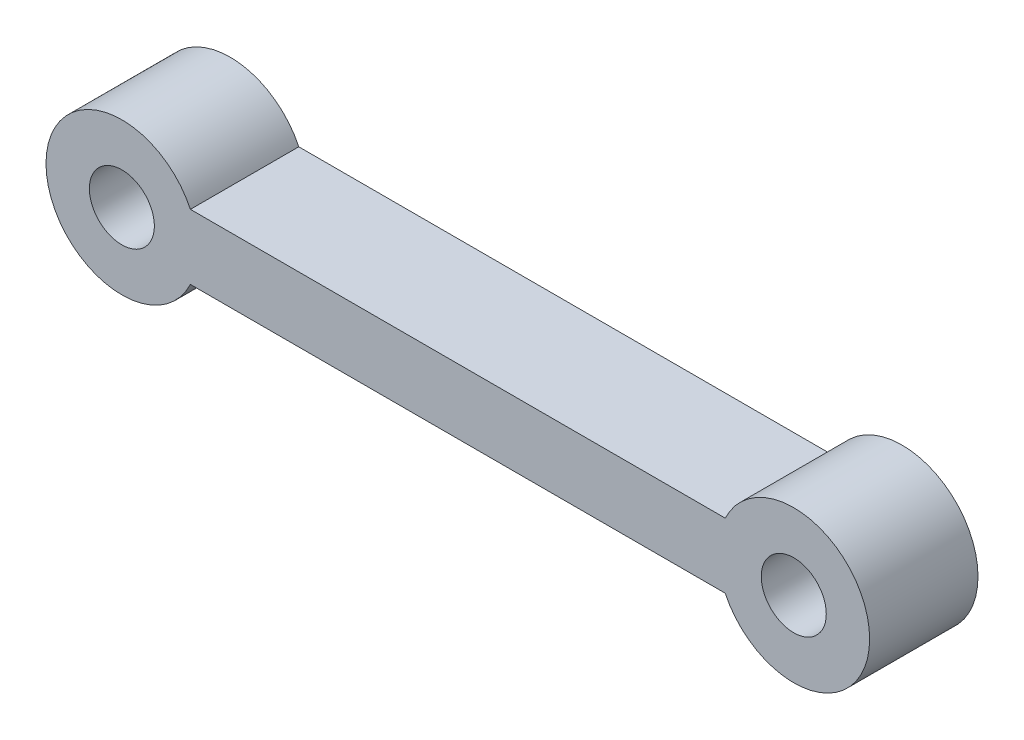
ISO-10303-21;
HEADER;
FILE_DESCRIPTION(('STEP AP214'),'2;1');
FILE_NAME('part.step','',(''),(''),'','','');
FILE_SCHEMA(('AUTOMOTIVE_DESIGN { 1 0 10303 214 1 1 1 1 }'));
ENDSEC;
DATA;
#1=APPLICATION_CONTEXT('core data for automotive mechanical design processes');
#2=APPLICATION_PROTOCOL_DEFINITION('international standard','automotive_design',2000,#1);
#3=PRODUCT_CONTEXT('',#1,'mechanical');
#4=PRODUCT('Part','Part','',(#3));
#5=PRODUCT_RELATED_PRODUCT_CATEGORY('part','',(#4));
#6=PRODUCT_DEFINITION_FORMATION('','',#4);
#7=PRODUCT_DEFINITION_CONTEXT('part definition',#1,'design');
#8=PRODUCT_DEFINITION('design','',#6,#7);
#9=PRODUCT_DEFINITION_SHAPE('','',#8);
#10=(LENGTH_UNIT() NAMED_UNIT(*) SI_UNIT(.MILLI.,.METRE.));
#11=(NAMED_UNIT(*) PLANE_ANGLE_UNIT() SI_UNIT($,.RADIAN.));
#12=(NAMED_UNIT(*) SI_UNIT($,.STERADIAN.) SOLID_ANGLE_UNIT());
#13=UNCERTAINTY_MEASURE_WITH_UNIT(LENGTH_MEASURE(1.E-05),#10,'distance_accuracy_value','');
#14=(GEOMETRIC_REPRESENTATION_CONTEXT(3) GLOBAL_UNCERTAINTY_ASSIGNED_CONTEXT((#13)) GLOBAL_UNIT_ASSIGNED_CONTEXT((#10,
#11,#12)) REPRESENTATION_CONTEXT('',''));
#15=CARTESIAN_POINT('',(0.,0.,0.));
#16=DIRECTION('',(0.,0.,1.));
#17=DIRECTION('',(1.,0.,0.));
#18=AXIS2_PLACEMENT_3D('',#15,#16,#17);
#19=CARTESIAN_POINT('',(31.,0.,5.));
#20=DIRECTION('',(0.,0.,-1.));
#21=DIRECTION('',(-1.,0.,0.));
#22=AXIS2_PLACEMENT_3D('',#19,#20,#21);
#23=CYLINDRICAL_SURFACE('',#22,3.5);
#24=CARTESIAN_POINT('',(31.,0.,0.));
#25=DIRECTION('',(0.,0.,1.));
#26=DIRECTION('',(1.,0.,0.));
#27=AXIS2_PLACEMENT_3D('',#24,#25,#26);
#28=CIRCLE('',#27,3.5);
#29=CARTESIAN_POINT('',(27.8377223398316,-1.5,0.));
#30=VERTEX_POINT('',#29);
#31=CARTESIAN_POINT('',(27.8377223398316,1.5,0.));
#32=VERTEX_POINT('',#31);
#33=EDGE_CURVE('E107',#30,#32,#28,.T.);
#34=ORIENTED_EDGE('',*,*,#33,.T.);
#35=DIRECTION('',(0.,0.,-1.));
#36=VECTOR('',#35,1.);
#37=CARTESIAN_POINT('',(27.8377223398316,1.5,5.));
#38=LINE('',#37,#36);
#39=CARTESIAN_POINT('',(27.8377223398316,1.5,5.));
#40=VERTEX_POINT('',#39);
#41=EDGE_CURVE('E11',#40,#32,#38,.T.);
#42=ORIENTED_EDGE('',*,*,#41,.F.);
#43=CARTESIAN_POINT('',(31.,0.,5.));
#44=DIRECTION('',(0.,0.,1.));
#45=DIRECTION('',(1.,0.,0.));
#46=AXIS2_PLACEMENT_3D('',#43,#44,#45);
#47=CIRCLE('',#46,3.5);
#48=CARTESIAN_POINT('',(27.8377223398316,-1.5,5.));
#49=VERTEX_POINT('',#48);
#50=EDGE_CURVE('E77',#49,#40,#47,.T.);
#51=ORIENTED_EDGE('',*,*,#50,.F.);
#52=DIRECTION('',(0.,0.,-1.));
#53=VECTOR('',#52,1.);
#54=CARTESIAN_POINT('',(27.8377223398316,-1.5,5.));
#55=LINE('',#54,#53);
#56=EDGE_CURVE('E103',#49,#30,#55,.T.);
#57=ORIENTED_EDGE('',*,*,#56,.T.);
#58=EDGE_LOOP('',(#34,#42,#51,#57));
#59=FACE_BOUND('',#58,.T.);
#60=ADVANCED_FACE('F34',(#59),#23,.T.);
#61=CARTESIAN_POINT('',(0.,1.5,5.));
#62=DIRECTION('',(0.,1.,0.));
#63=DIRECTION('',(0.,0.,1.));
#64=AXIS2_PLACEMENT_3D('',#61,#62,#63);
#65=PLANE('',#64);
#66=DIRECTION('',(1.,0.,0.));
#67=VECTOR('',#66,1.);
#68=CARTESIAN_POINT('',(0.,1.5,0.));
#69=LINE('',#68,#67);
#70=CARTESIAN_POINT('',(3.16227766016838,1.5,0.));
#71=VERTEX_POINT('',#70);
#72=EDGE_CURVE('E87',#71,#32,#69,.T.);
#73=ORIENTED_EDGE('',*,*,#72,.F.);
#74=DIRECTION('',(0.,0.,-1.));
#75=VECTOR('',#74,1.);
#76=CARTESIAN_POINT('',(3.16227766016838,1.5,5.));
#77=LINE('',#76,#75);
#78=CARTESIAN_POINT('',(3.16227766016838,1.5,5.));
#79=VERTEX_POINT('',#78);
#80=EDGE_CURVE('E43',#79,#71,#77,.T.);
#81=ORIENTED_EDGE('',*,*,#80,.F.);
#82=DIRECTION('',(1.,0.,0.));
#83=VECTOR('',#82,1.);
#84=CARTESIAN_POINT('',(0.,1.5,5.));
#85=LINE('',#84,#83);
#86=EDGE_CURVE('E85',#79,#40,#85,.T.);
#87=ORIENTED_EDGE('',*,*,#86,.T.);
#88=ORIENTED_EDGE('',*,*,#41,.T.);
#89=EDGE_LOOP('',(#73,#81,#87,#88));
#90=FACE_BOUND('',#89,.T.);
#91=ADVANCED_FACE('F84',(#90),#65,.T.);
#92=CARTESIAN_POINT('',(0.,0.,5.));
#93=DIRECTION('',(0.,0.,-1.));
#94=DIRECTION('',(-1.,0.,0.));
#95=AXIS2_PLACEMENT_3D('',#92,#93,#94);
#96=CYLINDRICAL_SURFACE('',#95,3.5);
#97=CARTESIAN_POINT('',(0.,0.,0.));
#98=DIRECTION('',(0.,0.,1.));
#99=DIRECTION('',(1.,0.,0.));
#100=AXIS2_PLACEMENT_3D('',#97,#98,#99);
#101=CIRCLE('',#100,3.5);
#102=CARTESIAN_POINT('',(3.16227766016838,-1.5,0.));
#103=VERTEX_POINT('',#102);
#104=EDGE_CURVE('E66',#71,#103,#101,.T.);
#105=ORIENTED_EDGE('',*,*,#104,.T.);
#106=DIRECTION('',(0.,0.,-1.));
#107=VECTOR('',#106,1.);
#108=CARTESIAN_POINT('',(3.16227766016838,-1.5,5.));
#109=LINE('',#108,#107);
#110=CARTESIAN_POINT('',(3.16227766016838,-1.5,5.));
#111=VERTEX_POINT('',#110);
#112=EDGE_CURVE('E88',#111,#103,#109,.T.);
#113=ORIENTED_EDGE('',*,*,#112,.F.);
#114=CARTESIAN_POINT('',(0.,0.,5.));
#115=DIRECTION('',(0.,0.,1.));
#116=DIRECTION('',(1.,0.,0.));
#117=AXIS2_PLACEMENT_3D('',#114,#115,#116);
#118=CIRCLE('',#117,3.5);
#119=EDGE_CURVE('E89',#79,#111,#118,.T.);
#120=ORIENTED_EDGE('',*,*,#119,.F.);
#121=ORIENTED_EDGE('',*,*,#80,.T.);
#122=EDGE_LOOP('',(#105,#113,#120,#121));
#123=FACE_BOUND('',#122,.T.);
#124=ADVANCED_FACE('F90',(#123),#96,.T.);
#125=CARTESIAN_POINT('',(0.,-1.5,5.));
#126=DIRECTION('',(0.,1.,0.));
#127=DIRECTION('',(0.,0.,1.));
#128=AXIS2_PLACEMENT_3D('',#125,#126,#127);
#129=PLANE('',#128);
#130=DIRECTION('',(1.,0.,0.));
#131=VECTOR('',#130,1.);
#132=CARTESIAN_POINT('',(0.,-1.5,0.));
#133=LINE('',#132,#131);
#134=EDGE_CURVE('E72',#103,#30,#133,.T.);
#135=ORIENTED_EDGE('',*,*,#134,.T.);
#136=ORIENTED_EDGE('',*,*,#56,.F.);
#137=DIRECTION('',(1.,0.,0.));
#138=VECTOR('',#137,1.);
#139=CARTESIAN_POINT('',(0.,-1.5,5.));
#140=LINE('',#139,#138);
#141=EDGE_CURVE('E51',#111,#49,#140,.T.);
#142=ORIENTED_EDGE('',*,*,#141,.F.);
#143=ORIENTED_EDGE('',*,*,#112,.T.);
#144=EDGE_LOOP('',(#135,#136,#142,#143));
#145=FACE_BOUND('',#144,.T.);
#146=ADVANCED_FACE('F117',(#145),#129,.F.);
#147=CARTESIAN_POINT('',(31.,0.,5.));
#148=DIRECTION('',(0.,0.,-1.));
#149=DIRECTION('',(-1.,0.,0.));
#150=AXIS2_PLACEMENT_3D('',#147,#148,#149);
#151=CYLINDRICAL_SURFACE('',#150,1.5);
#152=CARTESIAN_POINT('',(31.,0.,5.));
#153=DIRECTION('',(0.,0.,1.));
#154=DIRECTION('',(1.,0.,0.));
#155=AXIS2_PLACEMENT_3D('',#152,#153,#154);
#156=CIRCLE('',#155,1.5);
#157=CARTESIAN_POINT('',(32.5,0.,5.));
#158=VERTEX_POINT('',#157);
#159=EDGE_CURVE('E95',#158,#158,#156,.T.);
#160=ORIENTED_EDGE('',*,*,#159,.T.);
#161=EDGE_LOOP('',(#160));
#162=FACE_BOUND('',#161,.T.);
#163=CARTESIAN_POINT('',(31.,0.,0.));
#164=DIRECTION('',(0.,0.,1.));
#165=DIRECTION('',(1.,0.,0.));
#166=AXIS2_PLACEMENT_3D('',#163,#164,#165);
#167=CIRCLE('',#166,1.5);
#168=CARTESIAN_POINT('',(32.5,0.,0.));
#169=VERTEX_POINT('',#168);
#170=EDGE_CURVE('E104',#169,#169,#167,.T.);
#171=ORIENTED_EDGE('',*,*,#170,.F.);
#172=EDGE_LOOP('',(#171));
#173=FACE_BOUND('',#172,.T.);
#174=ADVANCED_FACE('F36',(#162,#173),#151,.F.);
#175=CARTESIAN_POINT('',(0.,0.,5.));
#176=DIRECTION('',(0.,0.,-1.));
#177=DIRECTION('',(-1.,0.,0.));
#178=AXIS2_PLACEMENT_3D('',#175,#176,#177);
#179=CYLINDRICAL_SURFACE('',#178,1.5);
#180=CARTESIAN_POINT('',(0.,0.,5.));
#181=DIRECTION('',(0.,0.,1.));
#182=DIRECTION('',(1.,0.,0.));
#183=AXIS2_PLACEMENT_3D('',#180,#181,#182);
#184=CIRCLE('',#183,1.5);
#185=CARTESIAN_POINT('',(1.5,0.,5.));
#186=VERTEX_POINT('',#185);
#187=EDGE_CURVE('E100',#186,#186,#184,.T.);
#188=ORIENTED_EDGE('',*,*,#187,.T.);
#189=EDGE_LOOP('',(#188));
#190=FACE_BOUND('',#189,.T.);
#191=CARTESIAN_POINT('',(0.,0.,0.));
#192=DIRECTION('',(0.,0.,1.));
#193=DIRECTION('',(1.,0.,0.));
#194=AXIS2_PLACEMENT_3D('',#191,#192,#193);
#195=CIRCLE('',#194,1.5);
#196=CARTESIAN_POINT('',(1.5,0.,0.));
#197=VERTEX_POINT('',#196);
#198=EDGE_CURVE('E113',#197,#197,#195,.T.);
#199=ORIENTED_EDGE('',*,*,#198,.F.);
#200=EDGE_LOOP('',(#199));
#201=FACE_BOUND('',#200,.T.);
#202=ADVANCED_FACE('F133',(#190,#201),#179,.F.);
#203=CARTESIAN_POINT('',(0.,0.,5.));
#204=DIRECTION('',(0.,0.,1.));
#205=DIRECTION('',(1.,0.,0.));
#206=AXIS2_PLACEMENT_3D('',#203,#204,#205);
#207=PLANE('',#206);
#208=ORIENTED_EDGE('',*,*,#159,.F.);
#209=EDGE_LOOP('',(#208));
#210=FACE_BOUND('',#209,.T.);
#211=ORIENTED_EDGE('',*,*,#50,.T.);
#212=ORIENTED_EDGE('',*,*,#86,.F.);
#213=ORIENTED_EDGE('',*,*,#119,.T.);
#214=ORIENTED_EDGE('',*,*,#141,.T.);
#215=EDGE_LOOP('',(#211,#212,#213,#214));
#216=FACE_BOUND('',#215,.T.);
#217=ORIENTED_EDGE('',*,*,#187,.F.);
#218=EDGE_LOOP('',(#217));
#219=FACE_BOUND('',#218,.T.);
#220=ADVANCED_FACE('F92',(#210,#216,#219),#207,.T.);
#221=CARTESIAN_POINT('',(0.,0.,0.));
#222=DIRECTION('',(0.,0.,1.));
#223=DIRECTION('',(1.,0.,0.));
#224=AXIS2_PLACEMENT_3D('',#221,#222,#223);
#225=PLANE('',#224);
#226=ORIENTED_EDGE('',*,*,#170,.T.);
#227=EDGE_LOOP('',(#226));
#228=FACE_BOUND('',#227,.T.);
#229=ORIENTED_EDGE('',*,*,#33,.F.);
#230=ORIENTED_EDGE('',*,*,#134,.F.);
#231=ORIENTED_EDGE('',*,*,#104,.F.);
#232=ORIENTED_EDGE('',*,*,#72,.T.);
#233=EDGE_LOOP('',(#229,#230,#231,#232));
#234=FACE_BOUND('',#233,.T.);
#235=ORIENTED_EDGE('',*,*,#198,.T.);
#236=EDGE_LOOP('',(#235));
#237=FACE_BOUND('',#236,.T.);
#238=ADVANCED_FACE('F120',(#228,#234,#237),#225,.F.);
#239=CLOSED_SHELL('',(#60,#91,#124,#146,#174,#202,#220,#238));
#240=MANIFOLD_SOLID_BREP('B2',#239);
#241=ADVANCED_BREP_SHAPE_REPRESENTATION('',(#18,#240),#14);
#242=SHAPE_DEFINITION_REPRESENTATION(#9,#241);
ENDSEC;
END-ISO-10303-21;
